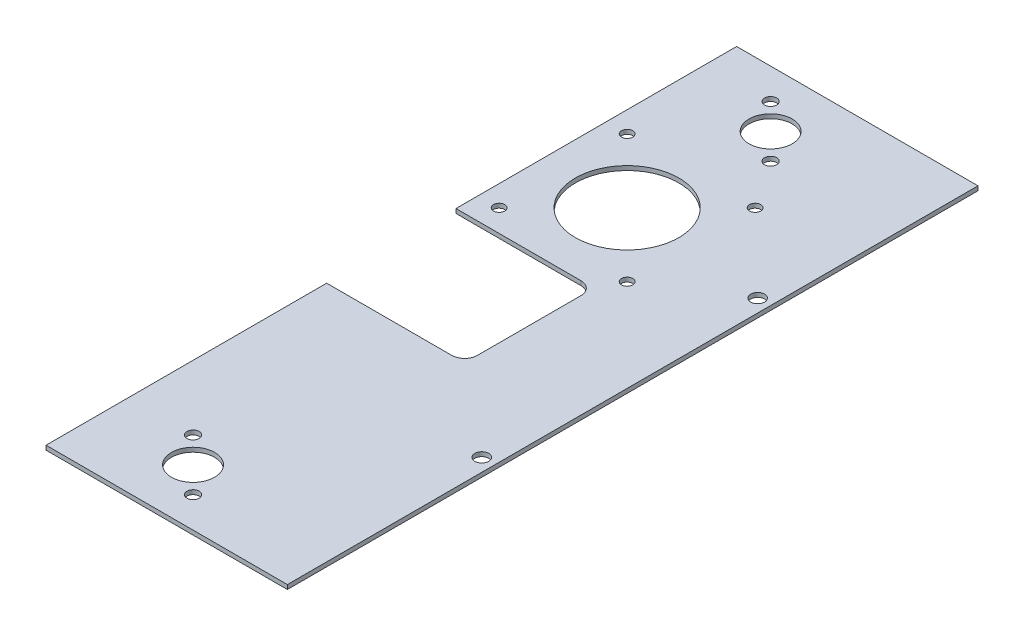
ISO-10303-21;
HEADER;
FILE_DESCRIPTION(('STEP AP214'),'2;1');
FILE_NAME('part.step','',(''),(''),'','','');
FILE_SCHEMA(('AUTOMOTIVE_DESIGN { 1 0 10303 214 1 1 1 1 }'));
ENDSEC;
DATA;
#1=APPLICATION_CONTEXT('core data for automotive mechanical design processes');
#2=APPLICATION_PROTOCOL_DEFINITION('international standard','automotive_design',2000,#1);
#3=PRODUCT_CONTEXT('',#1,'mechanical');
#4=PRODUCT('Part','Part','',(#3));
#5=PRODUCT_RELATED_PRODUCT_CATEGORY('part','',(#4));
#6=PRODUCT_DEFINITION_FORMATION('','',#4);
#7=PRODUCT_DEFINITION_CONTEXT('part definition',#1,'design');
#8=PRODUCT_DEFINITION('design','',#6,#7);
#9=PRODUCT_DEFINITION_SHAPE('','',#8);
#10=(LENGTH_UNIT() NAMED_UNIT(*) SI_UNIT(.MILLI.,.METRE.));
#11=(NAMED_UNIT(*) PLANE_ANGLE_UNIT() SI_UNIT($,.RADIAN.));
#12=(NAMED_UNIT(*) SI_UNIT($,.STERADIAN.) SOLID_ANGLE_UNIT());
#13=UNCERTAINTY_MEASURE_WITH_UNIT(LENGTH_MEASURE(1.E-05),#10,'distance_accuracy_value','');
#14=(GEOMETRIC_REPRESENTATION_CONTEXT(3) GLOBAL_UNCERTAINTY_ASSIGNED_CONTEXT((#13)) GLOBAL_UNIT_ASSIGNED_CONTEXT((#10,
#11,#12)) REPRESENTATION_CONTEXT('',''));
#15=CARTESIAN_POINT('',(0.,0.,0.));
#16=DIRECTION('',(0.,0.,1.));
#17=DIRECTION('',(1.,0.,0.));
#18=AXIS2_PLACEMENT_3D('',#15,#16,#17);
#19=CARTESIAN_POINT('',(23.8507599287772,1.5875,67.1734719931862));
#20=DIRECTION('',(0.,-1.,0.));
#21=DIRECTION('',(0.,0.,-1.));
#22=AXIS2_PLACEMENT_3D('',#19,#20,#21);
#23=PLANE('',#22);
#24=CARTESIAN_POINT('',(1.6257599287772,1.5875,-29.6640280068138));
#25=DIRECTION('',(0.,1.,0.));
#26=DIRECTION('',(0.,0.,1.));
#27=AXIS2_PLACEMENT_3D('',#24,#25,#26);
#28=CIRCLE('',#27,2.2479);
#29=CARTESIAN_POINT('',(1.6257599287772,1.5875,-27.4161280068138));
#30=VERTEX_POINT('',#29);
#31=EDGE_CURVE('E282',#30,#30,#28,.T.);
#32=ORIENTED_EDGE('',*,*,#31,.F.);
#33=EDGE_LOOP('',(#32));
#34=FACE_BOUND('',#33,.T.);
#35=CARTESIAN_POINT('',(20.6757599287772,1.5875,-10.6140280068138));
#36=DIRECTION('',(0.,1.,0.));
#37=DIRECTION('',(0.,0.,1.));
#38=AXIS2_PLACEMENT_3D('',#35,#36,#37);
#39=CIRCLE('',#38,2.2479);
#40=CARTESIAN_POINT('',(20.6757599287772,1.5875,-8.36612800681382));
#41=VERTEX_POINT('',#40);
#42=EDGE_CURVE('E279',#41,#41,#39,.T.);
#43=ORIENTED_EDGE('',*,*,#42,.F.);
#44=EDGE_LOOP('',(#43));
#45=FACE_BOUND('',#44,.T.);
#46=CARTESIAN_POINT('',(1.62575992877723,1.5875,183.060971993186));
#47=DIRECTION('',(0.,1.,0.));
#48=DIRECTION('',(0.,0.,1.));
#49=AXIS2_PLACEMENT_3D('',#46,#47,#48);
#50=CIRCLE('',#49,2.2479);
#51=CARTESIAN_POINT('',(1.62575992877723,1.5875,185.308871993186));
#52=VERTEX_POINT('',#51);
#53=EDGE_CURVE('E273',#52,#52,#50,.T.);
#54=ORIENTED_EDGE('',*,*,#53,.F.);
#55=EDGE_LOOP('',(#54));
#56=FACE_BOUND('',#55,.T.);
#57=CARTESIAN_POINT('',(20.6757599287772,1.5875,202.110971993186));
#58=DIRECTION('',(0.,1.,0.));
#59=DIRECTION('',(0.,0.,1.));
#60=AXIS2_PLACEMENT_3D('',#57,#58,#59);
#61=CIRCLE('',#60,2.2479);
#62=CARTESIAN_POINT('',(20.6757599287772,1.5875,204.358871993186));
#63=VERTEX_POINT('',#62);
#64=EDGE_CURVE('E267',#63,#63,#61,.T.);
#65=ORIENTED_EDGE('',*,*,#64,.F.);
#66=EDGE_LOOP('',(#65));
#67=FACE_BOUND('',#66,.T.);
#68=CARTESIAN_POINT('',(61.9507599287772,1.5875,137.023471993186));
#69=DIRECTION('',(0.,1.,0.));
#70=DIRECTION('',(0.,0.,1.));
#71=AXIS2_PLACEMENT_3D('',#68,#69,#70);
#72=CIRCLE('',#71,2.55269999999999);
#73=CARTESIAN_POINT('',(61.9507599287772,1.5875,139.576171993186));
#74=VERTEX_POINT('',#73);
#75=EDGE_CURVE('E261',#74,#74,#72,.T.);
#76=ORIENTED_EDGE('',*,*,#75,.F.);
#77=EDGE_LOOP('',(#76));
#78=FACE_BOUND('',#77,.T.);
#79=CARTESIAN_POINT('',(61.9507599287772,1.5875,35.4234719931862));
#80=DIRECTION('',(0.,1.,0.));
#81=DIRECTION('',(0.,0.,1.));
#82=AXIS2_PLACEMENT_3D('',#79,#80,#81);
#83=CIRCLE('',#82,2.55269999999999);
#84=CARTESIAN_POINT('',(61.9507599287772,1.5875,37.9761719931862));
#85=VERTEX_POINT('',#84);
#86=EDGE_CURVE('E255',#85,#85,#83,.T.);
#87=ORIENTED_EDGE('',*,*,#86,.F.);
#88=EDGE_LOOP('',(#87));
#89=FACE_BOUND('',#88,.T.);
#90=CARTESIAN_POINT('',(32.6772599287772,1.5875,54.2321719931862));
#91=DIRECTION('',(0.,1.,0.));
#92=DIRECTION('',(0.,0.,1.));
#93=AXIS2_PLACEMENT_3D('',#90,#91,#92);
#94=CIRCLE('',#93,2.06211473068407);
#95=CARTESIAN_POINT('',(32.6772599287772,1.5875,56.2942867238703));
#96=VERTEX_POINT('',#95);
#97=EDGE_CURVE('E238',#96,#96,#94,.T.);
#98=ORIENTED_EDGE('',*,*,#97,.F.);
#99=EDGE_LOOP('',(#98));
#100=FACE_BOUND('',#99,.T.);
#101=CARTESIAN_POINT('',(-14.4651400712228,1.5875,7.08977199318618));
#102=DIRECTION('',(0.,1.,0.));
#103=DIRECTION('',(0.,0.,1.));
#104=AXIS2_PLACEMENT_3D('',#101,#102,#103);
#105=CIRCLE('',#104,2.06211473068407);
#106=CARTESIAN_POINT('',(-14.4651400712228,1.5875,9.15188672387026));
#107=VERTEX_POINT('',#106);
#108=EDGE_CURVE('E226',#107,#107,#105,.T.);
#109=ORIENTED_EDGE('',*,*,#108,.F.);
#110=EDGE_LOOP('',(#109));
#111=FACE_BOUND('',#110,.T.);
#112=CARTESIAN_POINT('',(11.1507599287772,1.5875,-20.1390280068138));
#113=DIRECTION('',(0.,1.,0.));
#114=DIRECTION('',(0.,0.,1.));
#115=AXIS2_PLACEMENT_3D('',#112,#113,#114);
#116=CIRCLE('',#115,7.9375);
#117=CARTESIAN_POINT('',(11.1507599287772,1.5875,-12.2015280068138));
#118=VERTEX_POINT('',#117);
#119=EDGE_CURVE('E214',#118,#118,#116,.T.);
#120=ORIENTED_EDGE('',*,*,#119,.F.);
#121=EDGE_LOOP('',(#120));
#122=FACE_BOUND('',#121,.T.);
#123=DIRECTION('',(0.,0.,1.));
#124=VECTOR('',#123,1.);
#125=CARTESIAN_POINT('',(-22.1867400712228,1.5875,-40.9670280068138));
#126=LINE('',#125,#124);
#127=CARTESIAN_POINT('',(-22.1867400712228,1.5875,-40.9670280068138));
#128=VERTEX_POINT('',#127);
#129=CARTESIAN_POINT('',(-22.1867400712228,1.5875,62.4109719931862));
#130=VERTEX_POINT('',#129);
#131=EDGE_CURVE('E162',#128,#130,#126,.T.);
#132=ORIENTED_EDGE('',*,*,#131,.T.);
#133=DIRECTION('',(1.,0.,0.));
#134=VECTOR('',#133,1.);
#135=CARTESIAN_POINT('',(-22.1867400712228,1.5875,62.4109719931862));
#136=LINE('',#135,#134);
#137=CARTESIAN_POINT('',(23.8507599287772,1.5875,62.4109719931862));
#138=VERTEX_POINT('',#137);
#139=EDGE_CURVE('E100',#130,#138,#136,.T.);
#140=ORIENTED_EDGE('',*,*,#139,.T.);
#141=CARTESIAN_POINT('',(23.8507599287772,1.5875,67.1734719931862));
#142=DIRECTION('',(0.,-1.,0.));
#143=DIRECTION('',(0.,0.,-1.));
#144=AXIS2_PLACEMENT_3D('',#141,#142,#143);
#145=CIRCLE('',#144,4.7625);
#146=CARTESIAN_POINT('',(28.6132599287772,1.5875,67.1734719931862));
#147=VERTEX_POINT('',#146);
#148=EDGE_CURVE('E184',#138,#147,#145,.T.);
#149=ORIENTED_EDGE('',*,*,#148,.T.);
#150=DIRECTION('',(0.,0.,1.));
#151=VECTOR('',#150,1.);
#152=CARTESIAN_POINT('',(28.6132599287772,1.5875,67.1734719931862));
#153=LINE('',#152,#151);
#154=CARTESIAN_POINT('',(28.6132599287772,1.5875,105.273471993186));
#155=VERTEX_POINT('',#154);
#156=EDGE_CURVE('E203',#147,#155,#153,.T.);
#157=ORIENTED_EDGE('',*,*,#156,.T.);
#158=CARTESIAN_POINT('',(23.8507599287772,1.5875,105.273471993186));
#159=DIRECTION('',(0.,-1.,0.));
#160=DIRECTION('',(0.,0.,1.));
#161=AXIS2_PLACEMENT_3D('',#158,#159,#160);
#162=CIRCLE('',#161,4.7625);
#163=CARTESIAN_POINT('',(23.8507599287772,1.5875,110.035971993186));
#164=VERTEX_POINT('',#163);
#165=EDGE_CURVE('E200',#155,#164,#162,.T.);
#166=ORIENTED_EDGE('',*,*,#165,.T.);
#167=DIRECTION('',(-1.,0.,0.));
#168=VECTOR('',#167,1.);
#169=CARTESIAN_POINT('',(-22.1867400712228,1.5875,110.035971993186));
#170=LINE('',#169,#168);
#171=CARTESIAN_POINT('',(-22.1867400712228,1.5875,110.035971993186));
#172=VERTEX_POINT('',#171);
#173=EDGE_CURVE('E202',#164,#172,#170,.T.);
#174=ORIENTED_EDGE('',*,*,#173,.T.);
#175=DIRECTION('',(0.,0.,1.));
#176=VECTOR('',#175,1.);
#177=CARTESIAN_POINT('',(-22.1867400712228,1.5875,110.035971993186));
#178=LINE('',#177,#176);
#179=CARTESIAN_POINT('',(-22.1867400712228,1.5875,213.413971993186));
#180=VERTEX_POINT('',#179);
#181=EDGE_CURVE('E125',#172,#180,#178,.T.);
#182=ORIENTED_EDGE('',*,*,#181,.T.);
#183=DIRECTION('',(1.,0.,0.));
#184=VECTOR('',#183,1.);
#185=CARTESIAN_POINT('',(-22.1867400712228,1.5875,213.413971993186));
#186=LINE('',#185,#184);
#187=CARTESIAN_POINT('',(66.7132599287772,1.5875,213.413971993186));
#188=VERTEX_POINT('',#187);
#189=EDGE_CURVE('E119',#180,#188,#186,.T.);
#190=ORIENTED_EDGE('',*,*,#189,.T.);
#191=DIRECTION('',(0.,0.,-1.));
#192=VECTOR('',#191,1.);
#193=CARTESIAN_POINT('',(66.7132599287772,1.5875,-40.9670280068138));
#194=LINE('',#193,#192);
#195=CARTESIAN_POINT('',(66.7132599287772,1.5875,-40.9670280068138));
#196=VERTEX_POINT('',#195);
#197=EDGE_CURVE('E123',#188,#196,#194,.T.);
#198=ORIENTED_EDGE('',*,*,#197,.T.);
#199=DIRECTION('',(-1.,0.,0.));
#200=VECTOR('',#199,1.);
#201=CARTESIAN_POINT('',(-22.1867400712228,1.5875,-40.9670280068138));
#202=LINE('',#201,#200);
#203=EDGE_CURVE('E51',#196,#128,#202,.T.);
#204=ORIENTED_EDGE('',*,*,#203,.T.);
#205=EDGE_LOOP('',(#132,#140,#149,#157,#166,#174,#182,#190,#198,#204));
#206=FACE_BOUND('',#205,.T.);
#207=CARTESIAN_POINT('',(9.10605992877721,1.5875,30.6609719931862));
#208=DIRECTION('',(0.,1.,0.));
#209=DIRECTION('',(0.,0.,1.));
#210=AXIS2_PLACEMENT_3D('',#207,#208,#209);
#211=CIRCLE('',#210,19.05);
#212=CARTESIAN_POINT('',(9.10605992877721,1.5875,49.7109719931862));
#213=VERTEX_POINT('',#212);
#214=EDGE_CURVE('E147',#213,#213,#211,.T.);
#215=ORIENTED_EDGE('',*,*,#214,.F.);
#216=EDGE_LOOP('',(#215));
#217=FACE_BOUND('',#216,.T.);
#218=CARTESIAN_POINT('',(11.1507599287772,1.5875,192.585971993186));
#219=DIRECTION('',(0.,1.,0.));
#220=DIRECTION('',(0.,0.,1.));
#221=AXIS2_PLACEMENT_3D('',#218,#219,#220);
#222=CIRCLE('',#221,7.9375);
#223=CARTESIAN_POINT('',(11.1507599287772,1.5875,200.523471993186));
#224=VERTEX_POINT('',#223);
#225=EDGE_CURVE('E220',#224,#224,#222,.T.);
#226=ORIENTED_EDGE('',*,*,#225,.F.);
#227=EDGE_LOOP('',(#226));
#228=FACE_BOUND('',#227,.T.);
#229=CARTESIAN_POINT('',(32.6772599287772,1.5875,7.08977199318618));
#230=DIRECTION('',(0.,1.,0.));
#231=DIRECTION('',(0.,0.,-1.));
#232=AXIS2_PLACEMENT_3D('',#229,#230,#231);
#233=CIRCLE('',#232,2.06211473068407);
#234=CARTESIAN_POINT('',(32.6772599287772,1.5875,5.02765726250211));
#235=VERTEX_POINT('',#234);
#236=EDGE_CURVE('E232',#235,#235,#233,.T.);
#237=ORIENTED_EDGE('',*,*,#236,.F.);
#238=EDGE_LOOP('',(#237));
#239=FACE_BOUND('',#238,.T.);
#240=CARTESIAN_POINT('',(-14.4651400712228,1.5875,54.2321719931862));
#241=DIRECTION('',(0.,1.,0.));
#242=DIRECTION('',(0.,0.,-1.));
#243=AXIS2_PLACEMENT_3D('',#240,#241,#242);
#244=CIRCLE('',#243,2.06211473068407);
#245=CARTESIAN_POINT('',(-14.4651400712228,1.5875,52.1700572625021));
#246=VERTEX_POINT('',#245);
#247=EDGE_CURVE('E244',#246,#246,#244,.T.);
#248=ORIENTED_EDGE('',*,*,#247,.F.);
#249=EDGE_LOOP('',(#248));
#250=FACE_BOUND('',#249,.T.);
#251=ADVANCED_FACE('F33',(#34,#45,#56,#67,#78,#89,#100,#111,#122,#206,#217,#228,#239,#250),#23,.F.);
#252=CARTESIAN_POINT('',(23.8507599287772,0.,67.1734719931862));
#253=DIRECTION('',(0.,-1.,0.));
#254=DIRECTION('',(0.,0.,-1.));
#255=AXIS2_PLACEMENT_3D('',#252,#253,#254);
#256=PLANE('',#255);
#257=CARTESIAN_POINT('',(1.6257599287772,0.,-29.6640280068138));
#258=DIRECTION('',(0.,-1.,0.));
#259=DIRECTION('',(0.,0.,-1.));
#260=AXIS2_PLACEMENT_3D('',#257,#258,#259);
#261=CIRCLE('',#260,2.2479);
#262=CARTESIAN_POINT('',(1.6257599287772,0.,-31.9119280068138));
#263=VERTEX_POINT('',#262);
#264=EDGE_CURVE('E37',#263,#263,#261,.T.);
#265=ORIENTED_EDGE('',*,*,#264,.F.);
#266=EDGE_LOOP('',(#265));
#267=FACE_BOUND('',#266,.T.);
#268=CARTESIAN_POINT('',(20.6757599287772,0.,-10.6140280068138));
#269=DIRECTION('',(0.,-1.,0.));
#270=DIRECTION('',(0.,0.,-1.));
#271=AXIS2_PLACEMENT_3D('',#268,#269,#270);
#272=CIRCLE('',#271,2.2479);
#273=CARTESIAN_POINT('',(20.6757599287772,0.,-12.8619280068138));
#274=VERTEX_POINT('',#273);
#275=EDGE_CURVE('E276',#274,#274,#272,.T.);
#276=ORIENTED_EDGE('',*,*,#275,.F.);
#277=EDGE_LOOP('',(#276));
#278=FACE_BOUND('',#277,.T.);
#279=CARTESIAN_POINT('',(1.62575992877723,0.,183.060971993186));
#280=DIRECTION('',(0.,-1.,0.));
#281=DIRECTION('',(0.,0.,-1.));
#282=AXIS2_PLACEMENT_3D('',#279,#280,#281);
#283=CIRCLE('',#282,2.2479);
#284=CARTESIAN_POINT('',(1.62575992877723,0.,180.813071993186));
#285=VERTEX_POINT('',#284);
#286=EDGE_CURVE('E270',#285,#285,#283,.T.);
#287=ORIENTED_EDGE('',*,*,#286,.F.);
#288=EDGE_LOOP('',(#287));
#289=FACE_BOUND('',#288,.T.);
#290=CARTESIAN_POINT('',(20.6757599287772,0.,202.110971993186));
#291=DIRECTION('',(0.,-1.,0.));
#292=DIRECTION('',(0.,0.,-1.));
#293=AXIS2_PLACEMENT_3D('',#290,#291,#292);
#294=CIRCLE('',#293,2.2479);
#295=CARTESIAN_POINT('',(20.6757599287772,0.,199.863071993186));
#296=VERTEX_POINT('',#295);
#297=EDGE_CURVE('E264',#296,#296,#294,.T.);
#298=ORIENTED_EDGE('',*,*,#297,.F.);
#299=EDGE_LOOP('',(#298));
#300=FACE_BOUND('',#299,.T.);
#301=CARTESIAN_POINT('',(61.9507599287772,0.,137.023471993186));
#302=DIRECTION('',(0.,1.,0.));
#303=DIRECTION('',(0.,0.,1.));
#304=AXIS2_PLACEMENT_3D('',#301,#302,#303);
#305=CIRCLE('',#304,2.55270000000001);
#306=CARTESIAN_POINT('',(61.9507599287772,0.,139.576171993186));
#307=VERTEX_POINT('',#306);
#308=EDGE_CURVE('E258',#307,#307,#305,.T.);
#309=ORIENTED_EDGE('',*,*,#308,.T.);
#310=EDGE_LOOP('',(#309));
#311=FACE_BOUND('',#310,.T.);
#312=CARTESIAN_POINT('',(61.9507599287772,0.,35.4234719931862));
#313=DIRECTION('',(0.,1.,0.));
#314=DIRECTION('',(0.,0.,1.));
#315=AXIS2_PLACEMENT_3D('',#312,#313,#314);
#316=CIRCLE('',#315,2.55270000000001);
#317=CARTESIAN_POINT('',(61.9507599287772,0.,37.9761719931862));
#318=VERTEX_POINT('',#317);
#319=EDGE_CURVE('E250',#318,#318,#316,.T.);
#320=ORIENTED_EDGE('',*,*,#319,.T.);
#321=EDGE_LOOP('',(#320));
#322=FACE_BOUND('',#321,.T.);
#323=CARTESIAN_POINT('',(32.6772599287772,0.,54.2321719931862));
#324=DIRECTION('',(0.,1.,0.));
#325=DIRECTION('',(0.,0.,1.));
#326=AXIS2_PLACEMENT_3D('',#323,#324,#325);
#327=CIRCLE('',#326,2.06211473068407);
#328=CARTESIAN_POINT('',(32.6772599287772,0.,56.2942867238703));
#329=VERTEX_POINT('',#328);
#330=EDGE_CURVE('E241',#329,#329,#327,.T.);
#331=ORIENTED_EDGE('',*,*,#330,.T.);
#332=EDGE_LOOP('',(#331));
#333=FACE_BOUND('',#332,.T.);
#334=CARTESIAN_POINT('',(-14.4651400712228,0.,7.08977199318618));
#335=DIRECTION('',(0.,1.,0.));
#336=DIRECTION('',(0.,0.,1.));
#337=AXIS2_PLACEMENT_3D('',#334,#335,#336);
#338=CIRCLE('',#337,2.06211473068407);
#339=CARTESIAN_POINT('',(-14.4651400712228,0.,9.15188672387026));
#340=VERTEX_POINT('',#339);
#341=EDGE_CURVE('E229',#340,#340,#338,.T.);
#342=ORIENTED_EDGE('',*,*,#341,.T.);
#343=EDGE_LOOP('',(#342));
#344=FACE_BOUND('',#343,.T.);
#345=CARTESIAN_POINT('',(11.1507599287772,0.,-20.1390280068138));
#346=DIRECTION('',(0.,1.,0.));
#347=DIRECTION('',(0.,0.,1.));
#348=AXIS2_PLACEMENT_3D('',#345,#346,#347);
#349=CIRCLE('',#348,7.9375);
#350=CARTESIAN_POINT('',(11.1507599287772,0.,-12.2015280068138));
#351=VERTEX_POINT('',#350);
#352=EDGE_CURVE('E217',#351,#351,#349,.T.);
#353=ORIENTED_EDGE('',*,*,#352,.T.);
#354=EDGE_LOOP('',(#353));
#355=FACE_BOUND('',#354,.T.);
#356=DIRECTION('',(0.,0.,1.));
#357=VECTOR('',#356,1.);
#358=CARTESIAN_POINT('',(-22.1867400712228,0.,-40.9670280068138));
#359=LINE('',#358,#357);
#360=CARTESIAN_POINT('',(-22.1867400712228,0.,-40.9670280068138));
#361=VERTEX_POINT('',#360);
#362=CARTESIAN_POINT('',(-22.1867400712228,0.,62.4109719931862));
#363=VERTEX_POINT('',#362);
#364=EDGE_CURVE('E143',#361,#363,#359,.T.);
#365=ORIENTED_EDGE('',*,*,#364,.F.);
#366=DIRECTION('',(-1.,0.,0.));
#367=VECTOR('',#366,1.);
#368=CARTESIAN_POINT('',(-22.1867400712228,0.,-40.9670280068138));
#369=LINE('',#368,#367);
#370=CARTESIAN_POINT('',(66.7132599287772,0.,-40.9670280068138));
#371=VERTEX_POINT('',#370);
#372=EDGE_CURVE('E92',#371,#361,#369,.T.);
#373=ORIENTED_EDGE('',*,*,#372,.F.);
#374=DIRECTION('',(0.,0.,-1.));
#375=VECTOR('',#374,1.);
#376=CARTESIAN_POINT('',(66.7132599287772,0.,-40.9670280068138));
#377=LINE('',#376,#375);
#378=CARTESIAN_POINT('',(66.7132599287772,0.,213.413971993186));
#379=VERTEX_POINT('',#378);
#380=EDGE_CURVE('E86',#379,#371,#377,.T.);
#381=ORIENTED_EDGE('',*,*,#380,.F.);
#382=DIRECTION('',(1.,0.,0.));
#383=VECTOR('',#382,1.);
#384=CARTESIAN_POINT('',(-22.1867400712228,0.,213.413971993186));
#385=LINE('',#384,#383);
#386=CARTESIAN_POINT('',(-22.1867400712228,0.,213.413971993186));
#387=VERTEX_POINT('',#386);
#388=EDGE_CURVE('E133',#387,#379,#385,.T.);
#389=ORIENTED_EDGE('',*,*,#388,.F.);
#390=DIRECTION('',(0.,0.,1.));
#391=VECTOR('',#390,1.);
#392=CARTESIAN_POINT('',(-22.1867400712228,0.,110.035971993186));
#393=LINE('',#392,#391);
#394=CARTESIAN_POINT('',(-22.1867400712228,0.,110.035971993186));
#395=VERTEX_POINT('',#394);
#396=EDGE_CURVE('E157',#395,#387,#393,.T.);
#397=ORIENTED_EDGE('',*,*,#396,.F.);
#398=DIRECTION('',(-1.,0.,0.));
#399=VECTOR('',#398,1.);
#400=CARTESIAN_POINT('',(-22.1867400712228,0.,110.035971993186));
#401=LINE('',#400,#399);
#402=CARTESIAN_POINT('',(23.8507599287772,0.,110.035971993186));
#403=VERTEX_POINT('',#402);
#404=EDGE_CURVE('E155',#403,#395,#401,.T.);
#405=ORIENTED_EDGE('',*,*,#404,.F.);
#406=CARTESIAN_POINT('',(23.8507599287772,0.,105.273471993186));
#407=DIRECTION('',(0.,-1.,0.));
#408=DIRECTION('',(0.,0.,1.));
#409=AXIS2_PLACEMENT_3D('',#406,#407,#408);
#410=CIRCLE('',#409,4.7625);
#411=CARTESIAN_POINT('',(28.6132599287772,0.,105.273471993186));
#412=VERTEX_POINT('',#411);
#413=EDGE_CURVE('E153',#412,#403,#410,.T.);
#414=ORIENTED_EDGE('',*,*,#413,.F.);
#415=DIRECTION('',(0.,0.,1.));
#416=VECTOR('',#415,1.);
#417=CARTESIAN_POINT('',(28.6132599287772,0.,67.1734719931862));
#418=LINE('',#417,#416);
#419=CARTESIAN_POINT('',(28.6132599287772,0.,67.1734719931862));
#420=VERTEX_POINT('',#419);
#421=EDGE_CURVE('E151',#420,#412,#418,.T.);
#422=ORIENTED_EDGE('',*,*,#421,.F.);
#423=CARTESIAN_POINT('',(23.8507599287772,0.,67.1734719931862));
#424=DIRECTION('',(0.,-1.,0.));
#425=DIRECTION('',(0.,0.,-1.));
#426=AXIS2_PLACEMENT_3D('',#423,#424,#425);
#427=CIRCLE('',#426,4.7625);
#428=CARTESIAN_POINT('',(23.8507599287772,0.,62.4109719931862));
#429=VERTEX_POINT('',#428);
#430=EDGE_CURVE('E149',#429,#420,#427,.T.);
#431=ORIENTED_EDGE('',*,*,#430,.F.);
#432=DIRECTION('',(1.,0.,0.));
#433=VECTOR('',#432,1.);
#434=CARTESIAN_POINT('',(-22.1867400712228,0.,62.4109719931862));
#435=LINE('',#434,#433);
#436=EDGE_CURVE('E146',#363,#429,#435,.T.);
#437=ORIENTED_EDGE('',*,*,#436,.F.);
#438=EDGE_LOOP('',(#365,#373,#381,#389,#397,#405,#414,#422,#431,#437));
#439=FACE_BOUND('',#438,.T.);
#440=CARTESIAN_POINT('',(9.10605992877721,0.,30.6609719931862));
#441=DIRECTION('',(0.,1.,0.));
#442=DIRECTION('',(0.,0.,1.));
#443=AXIS2_PLACEMENT_3D('',#440,#441,#442);
#444=CIRCLE('',#443,19.05);
#445=CARTESIAN_POINT('',(9.10605992877721,0.,49.7109719931862));
#446=VERTEX_POINT('',#445);
#447=EDGE_CURVE('E211',#446,#446,#444,.T.);
#448=ORIENTED_EDGE('',*,*,#447,.T.);
#449=EDGE_LOOP('',(#448));
#450=FACE_BOUND('',#449,.T.);
#451=CARTESIAN_POINT('',(11.1507599287772,0.,192.585971993186));
#452=DIRECTION('',(0.,1.,0.));
#453=DIRECTION('',(0.,0.,1.));
#454=AXIS2_PLACEMENT_3D('',#451,#452,#453);
#455=CIRCLE('',#454,7.9375);
#456=CARTESIAN_POINT('',(11.1507599287772,0.,200.523471993186));
#457=VERTEX_POINT('',#456);
#458=EDGE_CURVE('E223',#457,#457,#455,.T.);
#459=ORIENTED_EDGE('',*,*,#458,.T.);
#460=EDGE_LOOP('',(#459));
#461=FACE_BOUND('',#460,.T.);
#462=CARTESIAN_POINT('',(32.6772599287772,0.,7.08977199318618));
#463=DIRECTION('',(0.,1.,0.));
#464=DIRECTION('',(0.,0.,-1.));
#465=AXIS2_PLACEMENT_3D('',#462,#463,#464);
#466=CIRCLE('',#465,2.06211473068407);
#467=CARTESIAN_POINT('',(32.6772599287772,0.,5.02765726250211));
#468=VERTEX_POINT('',#467);
#469=EDGE_CURVE('E235',#468,#468,#466,.T.);
#470=ORIENTED_EDGE('',*,*,#469,.T.);
#471=EDGE_LOOP('',(#470));
#472=FACE_BOUND('',#471,.T.);
#473=CARTESIAN_POINT('',(-14.4651400712228,0.,54.2321719931862));
#474=DIRECTION('',(0.,1.,0.));
#475=DIRECTION('',(0.,0.,-1.));
#476=AXIS2_PLACEMENT_3D('',#473,#474,#475);
#477=CIRCLE('',#476,2.06211473068407);
#478=CARTESIAN_POINT('',(-14.4651400712228,0.,52.1700572625021));
#479=VERTEX_POINT('',#478);
#480=EDGE_CURVE('E247',#479,#479,#477,.T.);
#481=ORIENTED_EDGE('',*,*,#480,.T.);
#482=EDGE_LOOP('',(#481));
#483=FACE_BOUND('',#482,.T.);
#484=ADVANCED_FACE('F188',(#267,#278,#289,#300,#311,#322,#333,#344,#355,#439,#450,#461,#472,
#483),#256,.T.);
#485=CARTESIAN_POINT('',(-22.1867400712228,1.5875,-40.9670280068138));
#486=DIRECTION('',(1.,0.,0.));
#487=DIRECTION('',(0.,0.,-1.));
#488=AXIS2_PLACEMENT_3D('',#485,#486,#487);
#489=PLANE('',#488);
#490=ORIENTED_EDGE('',*,*,#364,.T.);
#491=DIRECTION('',(0.,-1.,0.));
#492=VECTOR('',#491,1.);
#493=CARTESIAN_POINT('',(-22.1867400712228,1.5875,62.4109719931862));
#494=LINE('',#493,#492);
#495=EDGE_CURVE('E11',#130,#363,#494,.T.);
#496=ORIENTED_EDGE('',*,*,#495,.F.);
#497=ORIENTED_EDGE('',*,*,#131,.F.);
#498=DIRECTION('',(0.,-1.,0.));
#499=VECTOR('',#498,1.);
#500=CARTESIAN_POINT('',(-22.1867400712228,1.5875,-40.9670280068138));
#501=LINE('',#500,#499);
#502=EDGE_CURVE('E139',#128,#361,#501,.T.);
#503=ORIENTED_EDGE('',*,*,#502,.T.);
#504=EDGE_LOOP('',(#490,#496,#497,#503));
#505=FACE_BOUND('',#504,.T.);
#506=ADVANCED_FACE('F35',(#505),#489,.F.);
#507=CARTESIAN_POINT('',(-22.1867400712228,1.5875,62.4109719931862));
#508=DIRECTION('',(0.,0.,-1.));
#509=DIRECTION('',(-1.,0.,0.));
#510=AXIS2_PLACEMENT_3D('',#507,#508,#509);
#511=PLANE('',#510);
#512=ORIENTED_EDGE('',*,*,#436,.T.);
#513=DIRECTION('',(0.,-1.,0.));
#514=VECTOR('',#513,1.);
#515=CARTESIAN_POINT('',(23.8507599287772,1.5875,62.4109719931862));
#516=LINE('',#515,#514);
#517=EDGE_CURVE('E43',#138,#429,#516,.T.);
#518=ORIENTED_EDGE('',*,*,#517,.F.);
#519=ORIENTED_EDGE('',*,*,#139,.F.);
#520=ORIENTED_EDGE('',*,*,#495,.T.);
#521=EDGE_LOOP('',(#512,#518,#519,#520));
#522=FACE_BOUND('',#521,.T.);
#523=ADVANCED_FACE('F352',(#522),#511,.F.);
#524=CARTESIAN_POINT('',(23.8507599287772,1.5875,67.1734719931862));
#525=DIRECTION('',(0.,-1.,0.));
#526=DIRECTION('',(0.,0.,-1.));
#527=AXIS2_PLACEMENT_3D('',#524,#525,#526);
#528=CYLINDRICAL_SURFACE('',#527,4.7625);
#529=ORIENTED_EDGE('',*,*,#430,.T.);
#530=DIRECTION('',(0.,-1.,0.));
#531=VECTOR('',#530,1.);
#532=CARTESIAN_POINT('',(28.6132599287772,1.5875,67.1734719931862));
#533=LINE('',#532,#531);
#534=EDGE_CURVE('E175',#147,#420,#533,.T.);
#535=ORIENTED_EDGE('',*,*,#534,.F.);
#536=ORIENTED_EDGE('',*,*,#148,.F.);
#537=ORIENTED_EDGE('',*,*,#517,.T.);
#538=EDGE_LOOP('',(#529,#535,#536,#537));
#539=FACE_BOUND('',#538,.T.);
#540=ADVANCED_FACE('F182',(#539),#528,.F.);
#541=CARTESIAN_POINT('',(28.6132599287772,1.5875,67.1734719931862));
#542=DIRECTION('',(1.,0.,0.));
#543=DIRECTION('',(0.,0.,-1.));
#544=AXIS2_PLACEMENT_3D('',#541,#542,#543);
#545=PLANE('',#544);
#546=ORIENTED_EDGE('',*,*,#421,.T.);
#547=DIRECTION('',(0.,-1.,0.));
#548=VECTOR('',#547,1.);
#549=CARTESIAN_POINT('',(28.6132599287772,1.5875,105.273471993186));
#550=LINE('',#549,#548);
#551=EDGE_CURVE('E172',#155,#412,#550,.T.);
#552=ORIENTED_EDGE('',*,*,#551,.F.);
#553=ORIENTED_EDGE('',*,*,#156,.F.);
#554=ORIENTED_EDGE('',*,*,#534,.T.);
#555=EDGE_LOOP('',(#546,#552,#553,#554));
#556=FACE_BOUND('',#555,.T.);
#557=ADVANCED_FACE('F194',(#556),#545,.F.);
#558=CARTESIAN_POINT('',(23.8507599287772,1.5875,105.273471993186));
#559=DIRECTION('',(0.,-1.,0.));
#560=DIRECTION('',(0.,0.,-1.));
#561=AXIS2_PLACEMENT_3D('',#558,#559,#560);
#562=CYLINDRICAL_SURFACE('',#561,4.7625);
#563=ORIENTED_EDGE('',*,*,#413,.T.);
#564=DIRECTION('',(0.,-1.,0.));
#565=VECTOR('',#564,1.);
#566=CARTESIAN_POINT('',(23.8507599287772,1.5875,110.035971993186));
#567=LINE('',#566,#565);
#568=EDGE_CURVE('E169',#164,#403,#567,.T.);
#569=ORIENTED_EDGE('',*,*,#568,.F.);
#570=ORIENTED_EDGE('',*,*,#165,.F.);
#571=ORIENTED_EDGE('',*,*,#551,.T.);
#572=EDGE_LOOP('',(#563,#569,#570,#571));
#573=FACE_BOUND('',#572,.T.);
#574=ADVANCED_FACE('F198',(#573),#562,.F.);
#575=CARTESIAN_POINT('',(-22.1867400712228,1.5875,110.035971993186));
#576=DIRECTION('',(0.,0.,1.));
#577=DIRECTION('',(1.,0.,0.));
#578=AXIS2_PLACEMENT_3D('',#575,#576,#577);
#579=PLANE('',#578);
#580=ORIENTED_EDGE('',*,*,#404,.T.);
#581=DIRECTION('',(0.,-1.,0.));
#582=VECTOR('',#581,1.);
#583=CARTESIAN_POINT('',(-22.1867400712228,1.5875,110.035971993186));
#584=LINE('',#583,#582);
#585=EDGE_CURVE('E166',#172,#395,#584,.T.);
#586=ORIENTED_EDGE('',*,*,#585,.F.);
#587=ORIENTED_EDGE('',*,*,#173,.F.);
#588=ORIENTED_EDGE('',*,*,#568,.T.);
#589=EDGE_LOOP('',(#580,#586,#587,#588));
#590=FACE_BOUND('',#589,.T.);
#591=ADVANCED_FACE('F342',(#590),#579,.F.);
#592=CARTESIAN_POINT('',(-22.1867400712228,1.5875,110.035971993186));
#593=DIRECTION('',(1.,0.,0.));
#594=DIRECTION('',(0.,0.,-1.));
#595=AXIS2_PLACEMENT_3D('',#592,#593,#594);
#596=PLANE('',#595);
#597=ORIENTED_EDGE('',*,*,#396,.T.);
#598=DIRECTION('',(0.,-1.,0.));
#599=VECTOR('',#598,1.);
#600=CARTESIAN_POINT('',(-22.1867400712228,1.5875,213.413971993186));
#601=LINE('',#600,#599);
#602=EDGE_CURVE('E134',#180,#387,#601,.T.);
#603=ORIENTED_EDGE('',*,*,#602,.F.);
#604=ORIENTED_EDGE('',*,*,#181,.F.);
#605=ORIENTED_EDGE('',*,*,#585,.T.);
#606=EDGE_LOOP('',(#597,#603,#604,#605));
#607=FACE_BOUND('',#606,.T.);
#608=ADVANCED_FACE('F339',(#607),#596,.F.);
#609=CARTESIAN_POINT('',(-22.1867400712228,1.5875,213.413971993186));
#610=DIRECTION('',(0.,0.,-1.));
#611=DIRECTION('',(-1.,0.,0.));
#612=AXIS2_PLACEMENT_3D('',#609,#610,#611);
#613=PLANE('',#612);
#614=ORIENTED_EDGE('',*,*,#388,.T.);
#615=DIRECTION('',(0.,-1.,0.));
#616=VECTOR('',#615,1.);
#617=CARTESIAN_POINT('',(66.7132599287772,1.5875,213.413971993186));
#618=LINE('',#617,#616);
#619=EDGE_CURVE('E130',#188,#379,#618,.T.);
#620=ORIENTED_EDGE('',*,*,#619,.F.);
#621=ORIENTED_EDGE('',*,*,#189,.F.);
#622=ORIENTED_EDGE('',*,*,#602,.T.);
#623=EDGE_LOOP('',(#614,#620,#621,#622));
#624=FACE_BOUND('',#623,.T.);
#625=ADVANCED_FACE('F131',(#624),#613,.F.);
#626=CARTESIAN_POINT('',(66.7132599287772,1.5875,-40.9670280068138));
#627=DIRECTION('',(-1.,0.,0.));
#628=DIRECTION('',(0.,0.,1.));
#629=AXIS2_PLACEMENT_3D('',#626,#627,#628);
#630=PLANE('',#629);
#631=ORIENTED_EDGE('',*,*,#380,.T.);
#632=DIRECTION('',(0.,-1.,0.));
#633=VECTOR('',#632,1.);
#634=CARTESIAN_POINT('',(66.7132599287772,1.5875,-40.9670280068138));
#635=LINE('',#634,#633);
#636=EDGE_CURVE('E135',#196,#371,#635,.T.);
#637=ORIENTED_EDGE('',*,*,#636,.F.);
#638=ORIENTED_EDGE('',*,*,#197,.F.);
#639=ORIENTED_EDGE('',*,*,#619,.T.);
#640=EDGE_LOOP('',(#631,#637,#638,#639));
#641=FACE_BOUND('',#640,.T.);
#642=ADVANCED_FACE('F137',(#641),#630,.F.);
#643=CARTESIAN_POINT('',(-22.1867400712228,1.5875,-40.9670280068138));
#644=DIRECTION('',(0.,0.,1.));
#645=DIRECTION('',(1.,0.,0.));
#646=AXIS2_PLACEMENT_3D('',#643,#644,#645);
#647=PLANE('',#646);
#648=ORIENTED_EDGE('',*,*,#372,.T.);
#649=ORIENTED_EDGE('',*,*,#502,.F.);
#650=ORIENTED_EDGE('',*,*,#203,.F.);
#651=ORIENTED_EDGE('',*,*,#636,.T.);
#652=EDGE_LOOP('',(#648,#649,#650,#651));
#653=FACE_BOUND('',#652,.T.);
#654=ADVANCED_FACE('F323',(#653),#647,.F.);
#655=CARTESIAN_POINT('',(9.10605992877721,1.5875,30.6609719931862));
#656=DIRECTION('',(0.,-1.,0.));
#657=DIRECTION('',(0.,0.,-1.));
#658=AXIS2_PLACEMENT_3D('',#655,#656,#657);
#659=CYLINDRICAL_SURFACE('',#658,19.05);
#660=ORIENTED_EDGE('',*,*,#214,.T.);
#661=EDGE_LOOP('',(#660));
#662=FACE_BOUND('',#661,.T.);
#663=ORIENTED_EDGE('',*,*,#447,.F.);
#664=EDGE_LOOP('',(#663));
#665=FACE_BOUND('',#664,.T.);
#666=ADVANCED_FACE('F313',(#662,#665),#659,.F.);
#667=CARTESIAN_POINT('',(11.1507599287772,1.5875,-20.1390280068138));
#668=DIRECTION('',(0.,-1.,0.));
#669=DIRECTION('',(0.,0.,-1.));
#670=AXIS2_PLACEMENT_3D('',#667,#668,#669);
#671=CYLINDRICAL_SURFACE('',#670,7.9375);
#672=ORIENTED_EDGE('',*,*,#119,.T.);
#673=EDGE_LOOP('',(#672));
#674=FACE_BOUND('',#673,.T.);
#675=ORIENTED_EDGE('',*,*,#352,.F.);
#676=EDGE_LOOP('',(#675));
#677=FACE_BOUND('',#676,.T.);
#678=ADVANCED_FACE('F310',(#674,#677),#671,.F.);
#679=CARTESIAN_POINT('',(11.1507599287772,1.5875,192.585971993186));
#680=DIRECTION('',(0.,-1.,0.));
#681=DIRECTION('',(0.,0.,-1.));
#682=AXIS2_PLACEMENT_3D('',#679,#680,#681);
#683=CYLINDRICAL_SURFACE('',#682,7.9375);
#684=ORIENTED_EDGE('',*,*,#225,.T.);
#685=EDGE_LOOP('',(#684));
#686=FACE_BOUND('',#685,.T.);
#687=ORIENTED_EDGE('',*,*,#458,.F.);
#688=EDGE_LOOP('',(#687));
#689=FACE_BOUND('',#688,.T.);
#690=ADVANCED_FACE('F312',(#686,#689),#683,.F.);
#691=CARTESIAN_POINT('',(-14.4651400712228,1.5875,7.08977199318618));
#692=DIRECTION('',(0.,-1.,0.));
#693=DIRECTION('',(0.,0.,-1.));
#694=AXIS2_PLACEMENT_3D('',#691,#692,#693);
#695=CYLINDRICAL_SURFACE('',#694,2.06211473068407);
#696=ORIENTED_EDGE('',*,*,#108,.T.);
#697=EDGE_LOOP('',(#696));
#698=FACE_BOUND('',#697,.T.);
#699=ORIENTED_EDGE('',*,*,#341,.F.);
#700=EDGE_LOOP('',(#699));
#701=FACE_BOUND('',#700,.T.);
#702=ADVANCED_FACE('F320',(#698,#701),#695,.F.);
#703=CARTESIAN_POINT('',(32.6772599287772,1.5875,7.08977199318618));
#704=DIRECTION('',(0.,-1.,0.));
#705=DIRECTION('',(0.,0.,-1.));
#706=AXIS2_PLACEMENT_3D('',#703,#704,#705);
#707=CYLINDRICAL_SURFACE('',#706,2.06211473068407);
#708=ORIENTED_EDGE('',*,*,#236,.T.);
#709=EDGE_LOOP('',(#708));
#710=FACE_BOUND('',#709,.T.);
#711=ORIENTED_EDGE('',*,*,#469,.F.);
#712=EDGE_LOOP('',(#711));
#713=FACE_BOUND('',#712,.T.);
#714=ADVANCED_FACE('F430',(#710,#713),#707,.F.);
#715=CARTESIAN_POINT('',(32.6772599287772,1.5875,54.2321719931862));
#716=DIRECTION('',(0.,-1.,0.));
#717=DIRECTION('',(0.,0.,-1.));
#718=AXIS2_PLACEMENT_3D('',#715,#716,#717);
#719=CYLINDRICAL_SURFACE('',#718,2.06211473068407);
#720=ORIENTED_EDGE('',*,*,#97,.T.);
#721=EDGE_LOOP('',(#720));
#722=FACE_BOUND('',#721,.T.);
#723=ORIENTED_EDGE('',*,*,#330,.F.);
#724=EDGE_LOOP('',(#723));
#725=FACE_BOUND('',#724,.T.);
#726=ADVANCED_FACE('F426',(#722,#725),#719,.F.);
#727=CARTESIAN_POINT('',(-14.4651400712228,1.5875,54.2321719931862));
#728=DIRECTION('',(0.,-1.,0.));
#729=DIRECTION('',(0.,0.,-1.));
#730=AXIS2_PLACEMENT_3D('',#727,#728,#729);
#731=CYLINDRICAL_SURFACE('',#730,2.06211473068407);
#732=ORIENTED_EDGE('',*,*,#247,.T.);
#733=EDGE_LOOP('',(#732));
#734=FACE_BOUND('',#733,.T.);
#735=ORIENTED_EDGE('',*,*,#480,.F.);
#736=EDGE_LOOP('',(#735));
#737=FACE_BOUND('',#736,.T.);
#738=ADVANCED_FACE('F422',(#734,#737),#731,.F.);
#739=CARTESIAN_POINT('',(61.9507599287772,1.5875,35.4234719931862));
#740=DIRECTION('',(0.,1.,0.));
#741=DIRECTION('',(0.,0.,1.));
#742=AXIS2_PLACEMENT_3D('',#739,#740,#741);
#743=CYLINDRICAL_SURFACE('',#742,2.5527);
#744=ORIENTED_EDGE('',*,*,#319,.F.);
#745=EDGE_LOOP('',(#744));
#746=FACE_BOUND('',#745,.T.);
#747=ORIENTED_EDGE('',*,*,#86,.T.);
#748=EDGE_LOOP('',(#747));
#749=FACE_BOUND('',#748,.T.);
#750=ADVANCED_FACE('F418',(#746,#749),#743,.F.);
#751=CARTESIAN_POINT('',(61.9507599287772,1.5875,137.023471993186));
#752=DIRECTION('',(0.,1.,0.));
#753=DIRECTION('',(0.,0.,1.));
#754=AXIS2_PLACEMENT_3D('',#751,#752,#753);
#755=CYLINDRICAL_SURFACE('',#754,2.5527);
#756=ORIENTED_EDGE('',*,*,#308,.F.);
#757=EDGE_LOOP('',(#756));
#758=FACE_BOUND('',#757,.T.);
#759=ORIENTED_EDGE('',*,*,#75,.T.);
#760=EDGE_LOOP('',(#759));
#761=FACE_BOUND('',#760,.T.);
#762=ADVANCED_FACE('F382',(#758,#761),#755,.F.);
#763=CARTESIAN_POINT('',(20.6757599287772,1.5875,202.110971993186));
#764=DIRECTION('',(0.,1.,0.));
#765=DIRECTION('',(0.,0.,1.));
#766=AXIS2_PLACEMENT_3D('',#763,#764,#765);
#767=CYLINDRICAL_SURFACE('',#766,2.2479);
#768=ORIENTED_EDGE('',*,*,#297,.T.);
#769=EDGE_LOOP('',(#768));
#770=FACE_BOUND('',#769,.T.);
#771=ORIENTED_EDGE('',*,*,#64,.T.);
#772=EDGE_LOOP('',(#771));
#773=FACE_BOUND('',#772,.T.);
#774=ADVANCED_FACE('F376',(#770,#773),#767,.F.);
#775=CARTESIAN_POINT('',(1.62575992877723,1.5875,183.060971993186));
#776=DIRECTION('',(0.,1.,0.));
#777=DIRECTION('',(0.,0.,1.));
#778=AXIS2_PLACEMENT_3D('',#775,#776,#777);
#779=CYLINDRICAL_SURFACE('',#778,2.2479);
#780=ORIENTED_EDGE('',*,*,#286,.T.);
#781=EDGE_LOOP('',(#780));
#782=FACE_BOUND('',#781,.T.);
#783=ORIENTED_EDGE('',*,*,#53,.T.);
#784=EDGE_LOOP('',(#783));
#785=FACE_BOUND('',#784,.T.);
#786=ADVANCED_FACE('F381',(#782,#785),#779,.F.);
#787=CARTESIAN_POINT('',(20.6757599287772,1.5875,-10.6140280068138));
#788=DIRECTION('',(0.,1.,0.));
#789=DIRECTION('',(0.,0.,1.));
#790=AXIS2_PLACEMENT_3D('',#787,#788,#789);
#791=CYLINDRICAL_SURFACE('',#790,2.2479);
#792=ORIENTED_EDGE('',*,*,#275,.T.);
#793=EDGE_LOOP('',(#792));
#794=FACE_BOUND('',#793,.T.);
#795=ORIENTED_EDGE('',*,*,#42,.T.);
#796=EDGE_LOOP('',(#795));
#797=FACE_BOUND('',#796,.T.);
#798=ADVANCED_FACE('F394',(#794,#797),#791,.F.);
#799=CARTESIAN_POINT('',(1.6257599287772,1.5875,-29.6640280068138));
#800=DIRECTION('',(0.,1.,0.));
#801=DIRECTION('',(0.,0.,1.));
#802=AXIS2_PLACEMENT_3D('',#799,#800,#801);
#803=CYLINDRICAL_SURFACE('',#802,2.2479);
#804=ORIENTED_EDGE('',*,*,#264,.T.);
#805=EDGE_LOOP('',(#804));
#806=FACE_BOUND('',#805,.T.);
#807=ORIENTED_EDGE('',*,*,#31,.T.);
#808=EDGE_LOOP('',(#807));
#809=FACE_BOUND('',#808,.T.);
#810=ADVANCED_FACE('F289',(#806,#809),#803,.F.);
#811=CLOSED_SHELL('',(#251,#484,#506,#523,#540,#557,#574,#591,#608,#625,#642,#654,#666,#678,
#690,#702,#714,#726,#738,#750,#762,#774,#786,#798,#810));
#812=MANIFOLD_SOLID_BREP('B2',#811);
#813=ADVANCED_BREP_SHAPE_REPRESENTATION('',(#18,#812),#14);
#814=SHAPE_DEFINITION_REPRESENTATION(#9,#813);
ENDSEC;
END-ISO-10303-21;
